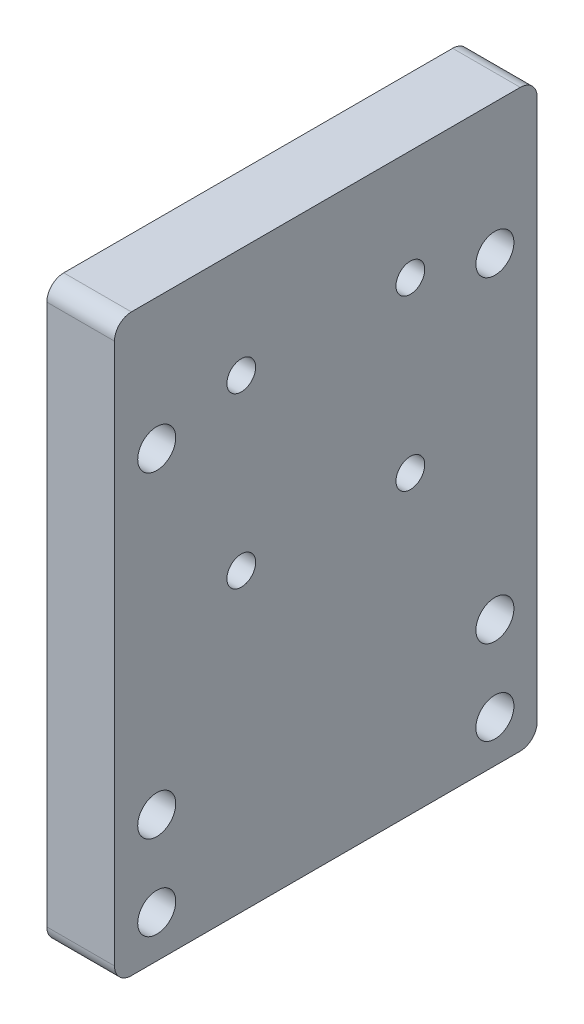
ISO-10303-21;
HEADER;
FILE_DESCRIPTION(('STEP AP214'),'2;1');
FILE_NAME('part.step','',(''),(''),'','','');
FILE_SCHEMA(('AUTOMOTIVE_DESIGN { 1 0 10303 214 1 1 1 1 }'));
ENDSEC;
DATA;
#1=APPLICATION_CONTEXT('core data for automotive mechanical design processes');
#2=APPLICATION_PROTOCOL_DEFINITION('international standard','automotive_design',2000,#1);
#3=PRODUCT_CONTEXT('',#1,'mechanical');
#4=PRODUCT('Part','Part','',(#3));
#5=PRODUCT_RELATED_PRODUCT_CATEGORY('part','',(#4));
#6=PRODUCT_DEFINITION_FORMATION('','',#4);
#7=PRODUCT_DEFINITION_CONTEXT('part definition',#1,'design');
#8=PRODUCT_DEFINITION('design','',#6,#7);
#9=PRODUCT_DEFINITION_SHAPE('','',#8);
#10=(LENGTH_UNIT() NAMED_UNIT(*) SI_UNIT(.MILLI.,.METRE.));
#11=(NAMED_UNIT(*) PLANE_ANGLE_UNIT() SI_UNIT($,.RADIAN.));
#12=(NAMED_UNIT(*) SI_UNIT($,.STERADIAN.) SOLID_ANGLE_UNIT());
#13=UNCERTAINTY_MEASURE_WITH_UNIT(LENGTH_MEASURE(1.E-05),#10,'distance_accuracy_value','');
#14=(GEOMETRIC_REPRESENTATION_CONTEXT(3) GLOBAL_UNCERTAINTY_ASSIGNED_CONTEXT((#13)) GLOBAL_UNIT_ASSIGNED_CONTEXT((#10,
#11,#12)) REPRESENTATION_CONTEXT('',''));
#15=CARTESIAN_POINT('',(0.,0.,0.));
#16=DIRECTION('',(0.,0.,1.));
#17=DIRECTION('',(1.,0.,0.));
#18=AXIS2_PLACEMENT_3D('',#15,#16,#17);
#19=CARTESIAN_POINT('',(8.,-34.,-25.));
#20=DIRECTION('',(0.,0.,1.));
#21=DIRECTION('',(1.,0.,0.));
#22=AXIS2_PLACEMENT_3D('',#19,#20,#21);
#23=PLANE('',#22);
#24=DIRECTION('',(0.,1.,0.));
#25=VECTOR('',#24,1.);
#26=CARTESIAN_POINT('',(8.,-34.,-25.));
#27=LINE('',#26,#25);
#28=CARTESIAN_POINT('',(8.,-32.,-25.));
#29=VERTEX_POINT('',#28);
#30=CARTESIAN_POINT('',(8.,32.,-25.));
#31=VERTEX_POINT('',#30);
#32=EDGE_CURVE('E128',#29,#31,#27,.T.);
#33=ORIENTED_EDGE('',*,*,#32,.F.);
#34=DIRECTION('',(-1.,0.,0.));
#35=VECTOR('',#34,1.);
#36=CARTESIAN_POINT('',(8.,-32.,-25.));
#37=LINE('',#36,#35);
#38=CARTESIAN_POINT('',(0.,-32.,-25.));
#39=VERTEX_POINT('',#38);
#40=EDGE_CURVE('E112',#29,#39,#37,.T.);
#41=ORIENTED_EDGE('',*,*,#40,.T.);
#42=DIRECTION('',(0.,1.,0.));
#43=VECTOR('',#42,1.);
#44=CARTESIAN_POINT('',(0.,-34.,-25.));
#45=LINE('',#44,#43);
#46=CARTESIAN_POINT('',(0.,32.,-25.));
#47=VERTEX_POINT('',#46);
#48=EDGE_CURVE('E125',#39,#47,#45,.T.);
#49=ORIENTED_EDGE('',*,*,#48,.T.);
#50=DIRECTION('',(-1.,0.,0.));
#51=VECTOR('',#50,1.);
#52=CARTESIAN_POINT('',(8.,32.,-25.));
#53=LINE('',#52,#51);
#54=EDGE_CURVE('E131',#47,#31,#53,.F.);
#55=ORIENTED_EDGE('',*,*,#54,.T.);
#56=EDGE_LOOP('',(#33,#41,#49,#55));
#57=FACE_BOUND('',#56,.T.);
#58=ADVANCED_FACE('F40',(#57),#23,.F.);
#59=CARTESIAN_POINT('',(8.,34.,25.));
#60=DIRECTION('',(0.,-1.,0.));
#61=DIRECTION('',(0.,0.,-1.));
#62=AXIS2_PLACEMENT_3D('',#59,#60,#61);
#63=PLANE('',#62);
#64=DIRECTION('',(0.,0.,1.));
#65=VECTOR('',#64,1.);
#66=CARTESIAN_POINT('',(8.,34.,25.));
#67=LINE('',#66,#65);
#68=CARTESIAN_POINT('',(8.,34.,-23.));
#69=VERTEX_POINT('',#68);
#70=CARTESIAN_POINT('',(8.,34.,23.));
#71=VERTEX_POINT('',#70);
#72=EDGE_CURVE('E193',#69,#71,#67,.T.);
#73=ORIENTED_EDGE('',*,*,#72,.F.);
#74=DIRECTION('',(-1.,0.,0.));
#75=VECTOR('',#74,1.);
#76=CARTESIAN_POINT('',(8.,34.,-23.));
#77=LINE('',#76,#75);
#78=CARTESIAN_POINT('',(0.,34.,-23.));
#79=VERTEX_POINT('',#78);
#80=EDGE_CURVE('E11',#69,#79,#77,.T.);
#81=ORIENTED_EDGE('',*,*,#80,.T.);
#82=DIRECTION('',(0.,0.,1.));
#83=VECTOR('',#82,1.);
#84=CARTESIAN_POINT('',(0.,34.,25.));
#85=LINE('',#84,#83);
#86=CARTESIAN_POINT('',(0.,34.,23.));
#87=VERTEX_POINT('',#86);
#88=EDGE_CURVE('E137',#79,#87,#85,.T.);
#89=ORIENTED_EDGE('',*,*,#88,.T.);
#90=DIRECTION('',(-1.,0.,0.));
#91=VECTOR('',#90,1.);
#92=CARTESIAN_POINT('',(8.,34.,23.));
#93=LINE('',#92,#91);
#94=EDGE_CURVE('E49',#87,#71,#93,.F.);
#95=ORIENTED_EDGE('',*,*,#94,.T.);
#96=EDGE_LOOP('',(#73,#81,#89,#95));
#97=FACE_BOUND('',#96,.T.);
#98=ADVANCED_FACE('F192',(#97),#63,.F.);
#99=CARTESIAN_POINT('',(8.,-34.,25.));
#100=DIRECTION('',(0.,0.,-1.));
#101=DIRECTION('',(-1.,0.,0.));
#102=AXIS2_PLACEMENT_3D('',#99,#100,#101);
#103=PLANE('',#102);
#104=DIRECTION('',(0.,-1.,0.));
#105=VECTOR('',#104,1.);
#106=CARTESIAN_POINT('',(0.,-34.,25.));
#107=LINE('',#106,#105);
#108=CARTESIAN_POINT('',(0.,32.,25.));
#109=VERTEX_POINT('',#108);
#110=CARTESIAN_POINT('',(0.,-32.,25.));
#111=VERTEX_POINT('',#110);
#112=EDGE_CURVE('E144',#109,#111,#107,.T.);
#113=ORIENTED_EDGE('',*,*,#112,.T.);
#114=DIRECTION('',(-1.,0.,0.));
#115=VECTOR('',#114,1.);
#116=CARTESIAN_POINT('',(8.,-32.,25.));
#117=LINE('',#116,#115);
#118=CARTESIAN_POINT('',(8.,-32.,25.));
#119=VERTEX_POINT('',#118);
#120=EDGE_CURVE('E56',#111,#119,#117,.F.);
#121=ORIENTED_EDGE('',*,*,#120,.T.);
#122=DIRECTION('',(0.,-1.,0.));
#123=VECTOR('',#122,1.);
#124=CARTESIAN_POINT('',(8.,-34.,25.));
#125=LINE('',#124,#123);
#126=CARTESIAN_POINT('',(8.,32.,25.));
#127=VERTEX_POINT('',#126);
#128=EDGE_CURVE('E200',#127,#119,#125,.T.);
#129=ORIENTED_EDGE('',*,*,#128,.F.);
#130=DIRECTION('',(-1.,0.,0.));
#131=VECTOR('',#130,1.);
#132=CARTESIAN_POINT('',(8.,32.,25.));
#133=LINE('',#132,#131);
#134=EDGE_CURVE('E182',#127,#109,#133,.T.);
#135=ORIENTED_EDGE('',*,*,#134,.T.);
#136=EDGE_LOOP('',(#113,#121,#129,#135));
#137=FACE_BOUND('',#136,.T.);
#138=ADVANCED_FACE('F204',(#137),#103,.F.);
#139=CARTESIAN_POINT('',(8.,-34.,25.));
#140=DIRECTION('',(0.,1.,0.));
#141=DIRECTION('',(0.,0.,1.));
#142=AXIS2_PLACEMENT_3D('',#139,#140,#141);
#143=PLANE('',#142);
#144=DIRECTION('',(0.,0.,-1.));
#145=VECTOR('',#144,1.);
#146=CARTESIAN_POINT('',(0.,-34.,25.));
#147=LINE('',#146,#145);
#148=CARTESIAN_POINT('',(0.,-34.,23.));
#149=VERTEX_POINT('',#148);
#150=CARTESIAN_POINT('',(0.,-34.,-23.));
#151=VERTEX_POINT('',#150);
#152=EDGE_CURVE('E155',#149,#151,#147,.T.);
#153=ORIENTED_EDGE('',*,*,#152,.T.);
#154=DIRECTION('',(-1.,0.,0.));
#155=VECTOR('',#154,1.);
#156=CARTESIAN_POINT('',(8.,-34.,-23.));
#157=LINE('',#156,#155);
#158=CARTESIAN_POINT('',(8.,-34.,-23.));
#159=VERTEX_POINT('',#158);
#160=EDGE_CURVE('E113',#151,#159,#157,.F.);
#161=ORIENTED_EDGE('',*,*,#160,.T.);
#162=DIRECTION('',(0.,0.,-1.));
#163=VECTOR('',#162,1.);
#164=CARTESIAN_POINT('',(8.,-34.,25.));
#165=LINE('',#164,#163);
#166=CARTESIAN_POINT('',(8.,-34.,23.));
#167=VERTEX_POINT('',#166);
#168=EDGE_CURVE('E150',#167,#159,#165,.T.);
#169=ORIENTED_EDGE('',*,*,#168,.F.);
#170=DIRECTION('',(-1.,0.,0.));
#171=VECTOR('',#170,1.);
#172=CARTESIAN_POINT('',(8.,-34.,23.));
#173=LINE('',#172,#171);
#174=EDGE_CURVE('E119',#167,#149,#173,.T.);
#175=ORIENTED_EDGE('',*,*,#174,.T.);
#176=EDGE_LOOP('',(#153,#161,#169,#175));
#177=FACE_BOUND('',#176,.T.);
#178=ADVANCED_FACE('F211',(#177),#143,.F.);
#179=CARTESIAN_POINT('',(8.,0.,0.));
#180=DIRECTION('',(-1.,0.,0.));
#181=DIRECTION('',(0.,0.,1.));
#182=AXIS2_PLACEMENT_3D('',#179,#180,#181);
#183=PLANE('',#182);
#184=CARTESIAN_POINT('',(8.00000000000001,-19.,20.));
#185=DIRECTION('',(-1.,0.,0.));
#186=DIRECTION('',(0.,0.,1.));
#187=AXIS2_PLACEMENT_3D('',#184,#185,#186);
#188=CIRCLE('',#187,2.24999999999999);
#189=CARTESIAN_POINT('',(8.00000000000001,-19.,22.25));
#190=VERTEX_POINT('',#189);
#191=EDGE_CURVE('E306',#190,#190,#188,.T.);
#192=ORIENTED_EDGE('',*,*,#191,.T.);
#193=EDGE_LOOP('',(#192));
#194=FACE_BOUND('',#193,.T.);
#195=CARTESIAN_POINT('',(8.00000000000001,18.5,20.));
#196=DIRECTION('',(-1.,0.,0.));
#197=DIRECTION('',(0.,0.,1.));
#198=AXIS2_PLACEMENT_3D('',#195,#196,#197);
#199=CIRCLE('',#198,2.24999999999999);
#200=CARTESIAN_POINT('',(8.00000000000001,18.5,22.25));
#201=VERTEX_POINT('',#200);
#202=EDGE_CURVE('E294',#201,#201,#199,.T.);
#203=ORIENTED_EDGE('',*,*,#202,.T.);
#204=EDGE_LOOP('',(#203));
#205=FACE_BOUND('',#204,.T.);
#206=CARTESIAN_POINT('',(8.00000000000001,18.5,-20.));
#207=DIRECTION('',(-1.,0.,0.));
#208=DIRECTION('',(0.,0.,1.));
#209=AXIS2_PLACEMENT_3D('',#206,#207,#208);
#210=CIRCLE('',#209,2.24999999999999);
#211=CARTESIAN_POINT('',(8.00000000000001,18.5,-17.75));
#212=VERTEX_POINT('',#211);
#213=EDGE_CURVE('E282',#212,#212,#210,.T.);
#214=ORIENTED_EDGE('',*,*,#213,.T.);
#215=EDGE_LOOP('',(#214));
#216=FACE_BOUND('',#215,.T.);
#217=CARTESIAN_POINT('',(8.00000000000001,-19.,-20.));
#218=DIRECTION('',(-1.,0.,0.));
#219=DIRECTION('',(0.,0.,1.));
#220=AXIS2_PLACEMENT_3D('',#217,#218,#219);
#221=CIRCLE('',#220,2.24999999999999);
#222=CARTESIAN_POINT('',(8.00000000000001,-19.,-17.75));
#223=VERTEX_POINT('',#222);
#224=EDGE_CURVE('E270',#223,#223,#221,.T.);
#225=ORIENTED_EDGE('',*,*,#224,.T.);
#226=EDGE_LOOP('',(#225));
#227=FACE_BOUND('',#226,.T.);
#228=CARTESIAN_POINT('',(8.,-29.,-20.));
#229=DIRECTION('',(-1.,0.,0.));
#230=DIRECTION('',(0.,0.,1.));
#231=AXIS2_PLACEMENT_3D('',#228,#229,#230);
#232=CIRCLE('',#231,2.25);
#233=CARTESIAN_POINT('',(8.,-29.,-17.75));
#234=VERTEX_POINT('',#233);
#235=EDGE_CURVE('E258',#234,#234,#232,.T.);
#236=ORIENTED_EDGE('',*,*,#235,.T.);
#237=EDGE_LOOP('',(#236));
#238=FACE_BOUND('',#237,.T.);
#239=CARTESIAN_POINT('',(8.,-29.,20.));
#240=DIRECTION('',(-1.,0.,0.));
#241=DIRECTION('',(0.,0.,1.));
#242=AXIS2_PLACEMENT_3D('',#239,#240,#241);
#243=CIRCLE('',#242,2.25);
#244=CARTESIAN_POINT('',(8.,-29.,22.25));
#245=VERTEX_POINT('',#244);
#246=EDGE_CURVE('E246',#245,#245,#243,.T.);
#247=ORIENTED_EDGE('',*,*,#246,.T.);
#248=EDGE_LOOP('',(#247));
#249=FACE_BOUND('',#248,.T.);
#250=CARTESIAN_POINT('',(8.,21.,10.));
#251=DIRECTION('',(1.,0.,0.));
#252=DIRECTION('',(0.,0.,-1.));
#253=AXIS2_PLACEMENT_3D('',#250,#251,#252);
#254=CIRCLE('',#253,1.7);
#255=CARTESIAN_POINT('',(8.,21.,8.30000000000001));
#256=VERTEX_POINT('',#255);
#257=EDGE_CURVE('E242',#256,#256,#254,.T.);
#258=ORIENTED_EDGE('',*,*,#257,.F.);
#259=EDGE_LOOP('',(#258));
#260=FACE_BOUND('',#259,.T.);
#261=CARTESIAN_POINT('',(8.,21.,-10.));
#262=DIRECTION('',(1.,0.,0.));
#263=DIRECTION('',(0.,0.,-1.));
#264=AXIS2_PLACEMENT_3D('',#261,#262,#263);
#265=CIRCLE('',#264,1.7);
#266=CARTESIAN_POINT('',(8.,21.,-11.7));
#267=VERTEX_POINT('',#266);
#268=EDGE_CURVE('E234',#267,#267,#265,.T.);
#269=ORIENTED_EDGE('',*,*,#268,.F.);
#270=EDGE_LOOP('',(#269));
#271=FACE_BOUND('',#270,.T.);
#272=CARTESIAN_POINT('',(8.,0.999999999999982,-10.));
#273=DIRECTION('',(1.,0.,0.));
#274=DIRECTION('',(0.,0.,-1.));
#275=AXIS2_PLACEMENT_3D('',#272,#273,#274);
#276=CIRCLE('',#275,1.7);
#277=CARTESIAN_POINT('',(8.,0.999999999999982,-11.7));
#278=VERTEX_POINT('',#277);
#279=EDGE_CURVE('E226',#278,#278,#276,.T.);
#280=ORIENTED_EDGE('',*,*,#279,.F.);
#281=EDGE_LOOP('',(#280));
#282=FACE_BOUND('',#281,.T.);
#283=CARTESIAN_POINT('',(8.,0.99999999999998,10.));
#284=DIRECTION('',(1.,0.,0.));
#285=DIRECTION('',(0.,0.,-1.));
#286=AXIS2_PLACEMENT_3D('',#283,#284,#285);
#287=CIRCLE('',#286,1.7);
#288=CARTESIAN_POINT('',(8.,0.99999999999998,8.30000000000001));
#289=VERTEX_POINT('',#288);
#290=EDGE_CURVE('E147',#289,#289,#287,.T.);
#291=ORIENTED_EDGE('',*,*,#290,.F.);
#292=EDGE_LOOP('',(#291));
#293=FACE_BOUND('',#292,.T.);
#294=ORIENTED_EDGE('',*,*,#168,.T.);
#295=CARTESIAN_POINT('',(8.,-32.,-23.));
#296=DIRECTION('',(-1.,0.,0.));
#297=DIRECTION('',(0.,0.,1.));
#298=AXIS2_PLACEMENT_3D('',#295,#296,#297);
#299=CIRCLE('',#298,2.);
#300=EDGE_CURVE('E179',#159,#29,#299,.F.);
#301=ORIENTED_EDGE('',*,*,#300,.T.);
#302=ORIENTED_EDGE('',*,*,#32,.T.);
#303=CARTESIAN_POINT('',(8.,32.,-23.));
#304=DIRECTION('',(-1.,0.,0.));
#305=DIRECTION('',(0.,0.,1.));
#306=AXIS2_PLACEMENT_3D('',#303,#304,#305);
#307=CIRCLE('',#306,2.);
#308=EDGE_CURVE('E173',#31,#69,#307,.F.);
#309=ORIENTED_EDGE('',*,*,#308,.T.);
#310=ORIENTED_EDGE('',*,*,#72,.T.);
#311=CARTESIAN_POINT('',(8.,32.,23.));
#312=DIRECTION('',(-1.,0.,0.));
#313=DIRECTION('',(0.,0.,1.));
#314=AXIS2_PLACEMENT_3D('',#311,#312,#313);
#315=CIRCLE('',#314,2.);
#316=EDGE_CURVE('E63',#71,#127,#315,.F.);
#317=ORIENTED_EDGE('',*,*,#316,.T.);
#318=ORIENTED_EDGE('',*,*,#128,.T.);
#319=CARTESIAN_POINT('',(8.,-32.,23.));
#320=DIRECTION('',(-1.,0.,0.));
#321=DIRECTION('',(0.,0.,1.));
#322=AXIS2_PLACEMENT_3D('',#319,#320,#321);
#323=CIRCLE('',#322,2.);
#324=EDGE_CURVE('E176',#119,#167,#323,.F.);
#325=ORIENTED_EDGE('',*,*,#324,.T.);
#326=EDGE_LOOP('',(#294,#301,#302,#309,#310,#317,#318,#325));
#327=FACE_BOUND('',#326,.T.);
#328=ADVANCED_FACE('F197',(#194,#205,#216,#227,#238,#249,#260,#271,#282,#293,#327),#183,.F.);
#329=CARTESIAN_POINT('',(0.,0.,0.));
#330=DIRECTION('',(-1.,0.,0.));
#331=DIRECTION('',(0.,0.,1.));
#332=AXIS2_PLACEMENT_3D('',#329,#330,#331);
#333=PLANE('',#332);
#334=CARTESIAN_POINT('',(0.,-19.,20.));
#335=DIRECTION('',(-1.,0.,0.));
#336=DIRECTION('',(0.,0.,1.));
#337=AXIS2_PLACEMENT_3D('',#334,#335,#336);
#338=CIRCLE('',#337,4.48);
#339=CARTESIAN_POINT('',(0.,-19.,24.48));
#340=VERTEX_POINT('',#339);
#341=EDGE_CURVE('E314',#340,#340,#338,.T.);
#342=ORIENTED_EDGE('',*,*,#341,.F.);
#343=EDGE_LOOP('',(#342));
#344=FACE_BOUND('',#343,.T.);
#345=CARTESIAN_POINT('',(0.,18.5,20.));
#346=DIRECTION('',(-1.,0.,0.));
#347=DIRECTION('',(0.,0.,1.));
#348=AXIS2_PLACEMENT_3D('',#345,#346,#347);
#349=CIRCLE('',#348,4.48);
#350=CARTESIAN_POINT('',(0.,18.5,24.48));
#351=VERTEX_POINT('',#350);
#352=EDGE_CURVE('E302',#351,#351,#349,.T.);
#353=ORIENTED_EDGE('',*,*,#352,.F.);
#354=EDGE_LOOP('',(#353));
#355=FACE_BOUND('',#354,.T.);
#356=CARTESIAN_POINT('',(0.,18.5,-20.));
#357=DIRECTION('',(-1.,0.,0.));
#358=DIRECTION('',(0.,0.,1.));
#359=AXIS2_PLACEMENT_3D('',#356,#357,#358);
#360=CIRCLE('',#359,4.48);
#361=CARTESIAN_POINT('',(0.,18.5,-15.52));
#362=VERTEX_POINT('',#361);
#363=EDGE_CURVE('E290',#362,#362,#360,.T.);
#364=ORIENTED_EDGE('',*,*,#363,.F.);
#365=EDGE_LOOP('',(#364));
#366=FACE_BOUND('',#365,.T.);
#367=CARTESIAN_POINT('',(0.,-19.,-20.));
#368=DIRECTION('',(-1.,0.,0.));
#369=DIRECTION('',(0.,0.,1.));
#370=AXIS2_PLACEMENT_3D('',#367,#368,#369);
#371=CIRCLE('',#370,4.48);
#372=CARTESIAN_POINT('',(0.,-19.,-15.52));
#373=VERTEX_POINT('',#372);
#374=EDGE_CURVE('E278',#373,#373,#371,.T.);
#375=ORIENTED_EDGE('',*,*,#374,.F.);
#376=EDGE_LOOP('',(#375));
#377=FACE_BOUND('',#376,.T.);
#378=CARTESIAN_POINT('',(0.,-29.,-20.));
#379=DIRECTION('',(-1.,0.,0.));
#380=DIRECTION('',(0.,0.,1.));
#381=AXIS2_PLACEMENT_3D('',#378,#379,#380);
#382=CIRCLE('',#381,4.48);
#383=CARTESIAN_POINT('',(0.,-29.,-15.52));
#384=VERTEX_POINT('',#383);
#385=EDGE_CURVE('E266',#384,#384,#382,.T.);
#386=ORIENTED_EDGE('',*,*,#385,.F.);
#387=EDGE_LOOP('',(#386));
#388=FACE_BOUND('',#387,.T.);
#389=CARTESIAN_POINT('',(0.,-29.,20.));
#390=DIRECTION('',(-1.,0.,0.));
#391=DIRECTION('',(0.,0.,1.));
#392=AXIS2_PLACEMENT_3D('',#389,#390,#391);
#393=CIRCLE('',#392,4.48);
#394=CARTESIAN_POINT('',(0.,-29.,24.48));
#395=VERTEX_POINT('',#394);
#396=EDGE_CURVE('E254',#395,#395,#393,.T.);
#397=ORIENTED_EDGE('',*,*,#396,.F.);
#398=EDGE_LOOP('',(#397));
#399=FACE_BOUND('',#398,.T.);
#400=CARTESIAN_POINT('',(0.,21.,10.));
#401=DIRECTION('',(1.,0.,0.));
#402=DIRECTION('',(0.,0.,-1.));
#403=AXIS2_PLACEMENT_3D('',#400,#401,#402);
#404=CIRCLE('',#403,1.69999999999999);
#405=CARTESIAN_POINT('',(0.,21.,8.30000000000001));
#406=VERTEX_POINT('',#405);
#407=EDGE_CURVE('E238',#406,#406,#404,.T.);
#408=ORIENTED_EDGE('',*,*,#407,.T.);
#409=EDGE_LOOP('',(#408));
#410=FACE_BOUND('',#409,.T.);
#411=CARTESIAN_POINT('',(0.,21.,-10.));
#412=DIRECTION('',(1.,0.,0.));
#413=DIRECTION('',(0.,0.,-1.));
#414=AXIS2_PLACEMENT_3D('',#411,#412,#413);
#415=CIRCLE('',#414,1.69999999999999);
#416=CARTESIAN_POINT('',(0.,21.,-11.7));
#417=VERTEX_POINT('',#416);
#418=EDGE_CURVE('E230',#417,#417,#415,.T.);
#419=ORIENTED_EDGE('',*,*,#418,.T.);
#420=EDGE_LOOP('',(#419));
#421=FACE_BOUND('',#420,.T.);
#422=CARTESIAN_POINT('',(0.,0.999999999999982,-10.));
#423=DIRECTION('',(1.,0.,0.));
#424=DIRECTION('',(0.,0.,-1.));
#425=AXIS2_PLACEMENT_3D('',#422,#423,#424);
#426=CIRCLE('',#425,1.69999999999999);
#427=CARTESIAN_POINT('',(0.,0.999999999999982,-11.7));
#428=VERTEX_POINT('',#427);
#429=EDGE_CURVE('E222',#428,#428,#426,.T.);
#430=ORIENTED_EDGE('',*,*,#429,.T.);
#431=EDGE_LOOP('',(#430));
#432=FACE_BOUND('',#431,.T.);
#433=CARTESIAN_POINT('',(0.,0.99999999999998,10.));
#434=DIRECTION('',(1.,0.,0.));
#435=DIRECTION('',(0.,0.,-1.));
#436=AXIS2_PLACEMENT_3D('',#433,#434,#435);
#437=CIRCLE('',#436,1.69999999999999);
#438=CARTESIAN_POINT('',(0.,0.99999999999998,8.30000000000001));
#439=VERTEX_POINT('',#438);
#440=EDGE_CURVE('E138',#439,#439,#437,.T.);
#441=ORIENTED_EDGE('',*,*,#440,.T.);
#442=EDGE_LOOP('',(#441));
#443=FACE_BOUND('',#442,.T.);
#444=ORIENTED_EDGE('',*,*,#48,.F.);
#445=CARTESIAN_POINT('',(0.,-32.,-23.));
#446=DIRECTION('',(-1.,0.,0.));
#447=DIRECTION('',(0.,0.,1.));
#448=AXIS2_PLACEMENT_3D('',#445,#446,#447);
#449=CIRCLE('',#448,2.);
#450=EDGE_CURVE('E108',#39,#151,#449,.T.);
#451=ORIENTED_EDGE('',*,*,#450,.T.);
#452=ORIENTED_EDGE('',*,*,#152,.F.);
#453=CARTESIAN_POINT('',(0.,-32.,23.));
#454=DIRECTION('',(-1.,0.,0.));
#455=DIRECTION('',(0.,0.,1.));
#456=AXIS2_PLACEMENT_3D('',#453,#454,#455);
#457=CIRCLE('',#456,2.);
#458=EDGE_CURVE('E120',#149,#111,#457,.T.);
#459=ORIENTED_EDGE('',*,*,#458,.T.);
#460=ORIENTED_EDGE('',*,*,#112,.F.);
#461=CARTESIAN_POINT('',(0.,32.,23.));
#462=DIRECTION('',(-1.,0.,0.));
#463=DIRECTION('',(0.,0.,1.));
#464=AXIS2_PLACEMENT_3D('',#461,#462,#463);
#465=CIRCLE('',#464,2.);
#466=EDGE_CURVE('E130',#109,#87,#465,.T.);
#467=ORIENTED_EDGE('',*,*,#466,.T.);
#468=ORIENTED_EDGE('',*,*,#88,.F.);
#469=CARTESIAN_POINT('',(0.,32.,-23.));
#470=DIRECTION('',(-1.,0.,0.));
#471=DIRECTION('',(0.,0.,1.));
#472=AXIS2_PLACEMENT_3D('',#469,#470,#471);
#473=CIRCLE('',#472,2.);
#474=EDGE_CURVE('E135',#79,#47,#473,.T.);
#475=ORIENTED_EDGE('',*,*,#474,.T.);
#476=EDGE_LOOP('',(#444,#451,#452,#459,#460,#467,#468,#475));
#477=FACE_BOUND('',#476,.T.);
#478=ADVANCED_FACE('F133',(#344,#355,#366,#377,#388,#399,#410,#421,#432,#443,#477),#333,.T.);
#479=CARTESIAN_POINT('',(8.,0.99999999999998,10.));
#480=DIRECTION('',(1.,0.,0.));
#481=DIRECTION('',(0.,0.,-1.));
#482=AXIS2_PLACEMENT_3D('',#479,#480,#481);
#483=CYLINDRICAL_SURFACE('',#482,1.69999999999999);
#484=ORIENTED_EDGE('',*,*,#440,.F.);
#485=EDGE_LOOP('',(#484));
#486=FACE_BOUND('',#485,.T.);
#487=ORIENTED_EDGE('',*,*,#290,.T.);
#488=EDGE_LOOP('',(#487));
#489=FACE_BOUND('',#488,.T.);
#490=ADVANCED_FACE('F324',(#486,#489),#483,.F.);
#491=CARTESIAN_POINT('',(8.,0.999999999999982,-10.));
#492=DIRECTION('',(1.,0.,0.));
#493=DIRECTION('',(0.,0.,-1.));
#494=AXIS2_PLACEMENT_3D('',#491,#492,#493);
#495=CYLINDRICAL_SURFACE('',#494,1.69999999999999);
#496=ORIENTED_EDGE('',*,*,#429,.F.);
#497=EDGE_LOOP('',(#496));
#498=FACE_BOUND('',#497,.T.);
#499=ORIENTED_EDGE('',*,*,#279,.T.);
#500=EDGE_LOOP('',(#499));
#501=FACE_BOUND('',#500,.T.);
#502=ADVANCED_FACE('F346',(#498,#501),#495,.F.);
#503=CARTESIAN_POINT('',(8.,21.,-10.));
#504=DIRECTION('',(1.,0.,0.));
#505=DIRECTION('',(0.,0.,-1.));
#506=AXIS2_PLACEMENT_3D('',#503,#504,#505);
#507=CYLINDRICAL_SURFACE('',#506,1.69999999999999);
#508=ORIENTED_EDGE('',*,*,#418,.F.);
#509=EDGE_LOOP('',(#508));
#510=FACE_BOUND('',#509,.T.);
#511=ORIENTED_EDGE('',*,*,#268,.T.);
#512=EDGE_LOOP('',(#511));
#513=FACE_BOUND('',#512,.T.);
#514=ADVANCED_FACE('F411',(#510,#513),#507,.F.);
#515=CARTESIAN_POINT('',(8.,21.,10.));
#516=DIRECTION('',(1.,0.,0.));
#517=DIRECTION('',(0.,0.,-1.));
#518=AXIS2_PLACEMENT_3D('',#515,#516,#517);
#519=CYLINDRICAL_SURFACE('',#518,1.69999999999999);
#520=ORIENTED_EDGE('',*,*,#407,.F.);
#521=EDGE_LOOP('',(#520));
#522=FACE_BOUND('',#521,.T.);
#523=ORIENTED_EDGE('',*,*,#257,.T.);
#524=EDGE_LOOP('',(#523));
#525=FACE_BOUND('',#524,.T.);
#526=ADVANCED_FACE('F407',(#522,#525),#519,.F.);
#527=CARTESIAN_POINT('',(0.,-29.,20.));
#528=DIRECTION('',(-1.,0.,0.));
#529=DIRECTION('',(0.,0.,1.));
#530=AXIS2_PLACEMENT_3D('',#527,#528,#529);
#531=CYLINDRICAL_SURFACE('',#530,2.25);
#532=ORIENTED_EDGE('',*,*,#246,.F.);
#533=EDGE_LOOP('',(#532));
#534=FACE_BOUND('',#533,.T.);
#535=CARTESIAN_POINT('',(2.23,-29.,20.));
#536=DIRECTION('',(-1.,0.,0.));
#537=DIRECTION('',(0.,0.,1.));
#538=AXIS2_PLACEMENT_3D('',#535,#536,#537);
#539=CIRCLE('',#538,2.25);
#540=CARTESIAN_POINT('',(2.23,-29.,22.25));
#541=VERTEX_POINT('',#540);
#542=EDGE_CURVE('E250',#541,#541,#539,.T.);
#543=ORIENTED_EDGE('',*,*,#542,.T.);
#544=EDGE_LOOP('',(#543));
#545=FACE_BOUND('',#544,.T.);
#546=ADVANCED_FACE('F403',(#534,#545),#531,.F.);
#547=CARTESIAN_POINT('',(0.,-29.,20.));
#548=DIRECTION('',(-1.,0.,0.));
#549=DIRECTION('',(0.,0.,1.));
#550=AXIS2_PLACEMENT_3D('',#547,#548,#549);
#551=CONICAL_SURFACE('',#550,4.48,0.785398163397448);
#552=ORIENTED_EDGE('',*,*,#542,.F.);
#553=EDGE_LOOP('',(#552));
#554=FACE_BOUND('',#553,.T.);
#555=ORIENTED_EDGE('',*,*,#396,.T.);
#556=EDGE_LOOP('',(#555));
#557=FACE_BOUND('',#556,.T.);
#558=ADVANCED_FACE('F399',(#554,#557),#551,.F.);
#559=CARTESIAN_POINT('',(0.,-29.,-20.));
#560=DIRECTION('',(-1.,0.,0.));
#561=DIRECTION('',(0.,0.,1.));
#562=AXIS2_PLACEMENT_3D('',#559,#560,#561);
#563=CYLINDRICAL_SURFACE('',#562,2.25);
#564=ORIENTED_EDGE('',*,*,#235,.F.);
#565=EDGE_LOOP('',(#564));
#566=FACE_BOUND('',#565,.T.);
#567=CARTESIAN_POINT('',(2.23,-29.,-20.));
#568=DIRECTION('',(-1.,0.,0.));
#569=DIRECTION('',(0.,0.,1.));
#570=AXIS2_PLACEMENT_3D('',#567,#568,#569);
#571=CIRCLE('',#570,2.25);
#572=CARTESIAN_POINT('',(2.23,-29.,-17.75));
#573=VERTEX_POINT('',#572);
#574=EDGE_CURVE('E262',#573,#573,#571,.T.);
#575=ORIENTED_EDGE('',*,*,#574,.T.);
#576=EDGE_LOOP('',(#575));
#577=FACE_BOUND('',#576,.T.);
#578=ADVANCED_FACE('F395',(#566,#577),#563,.F.);
#579=CARTESIAN_POINT('',(0.,-29.,-20.));
#580=DIRECTION('',(-1.,0.,0.));
#581=DIRECTION('',(0.,0.,1.));
#582=AXIS2_PLACEMENT_3D('',#579,#580,#581);
#583=CONICAL_SURFACE('',#582,4.48,0.785398163397448);
#584=ORIENTED_EDGE('',*,*,#574,.F.);
#585=EDGE_LOOP('',(#584));
#586=FACE_BOUND('',#585,.T.);
#587=ORIENTED_EDGE('',*,*,#385,.T.);
#588=EDGE_LOOP('',(#587));
#589=FACE_BOUND('',#588,.T.);
#590=ADVANCED_FACE('F368',(#586,#589),#583,.F.);
#591=CARTESIAN_POINT('',(8.,-32.,-23.));
#592=DIRECTION('',(-1.,0.,0.));
#593=DIRECTION('',(0.,0.,1.));
#594=AXIS2_PLACEMENT_3D('',#591,#592,#593);
#595=CYLINDRICAL_SURFACE('',#594,2.);
#596=ORIENTED_EDGE('',*,*,#300,.F.);
#597=ORIENTED_EDGE('',*,*,#160,.F.);
#598=ORIENTED_EDGE('',*,*,#450,.F.);
#599=ORIENTED_EDGE('',*,*,#40,.F.);
#600=EDGE_LOOP('',(#596,#597,#598,#599));
#601=FACE_BOUND('',#600,.T.);
#602=ADVANCED_FACE('F111',(#601),#595,.T.);
#603=CARTESIAN_POINT('',(8.,-32.,23.));
#604=DIRECTION('',(-1.,0.,0.));
#605=DIRECTION('',(0.,0.,1.));
#606=AXIS2_PLACEMENT_3D('',#603,#604,#605);
#607=CYLINDRICAL_SURFACE('',#606,2.);
#608=ORIENTED_EDGE('',*,*,#324,.F.);
#609=ORIENTED_EDGE('',*,*,#120,.F.);
#610=ORIENTED_EDGE('',*,*,#458,.F.);
#611=ORIENTED_EDGE('',*,*,#174,.F.);
#612=EDGE_LOOP('',(#608,#609,#610,#611));
#613=FACE_BOUND('',#612,.T.);
#614=ADVANCED_FACE('F208',(#613),#607,.T.);
#615=CARTESIAN_POINT('',(8.,32.,-23.));
#616=DIRECTION('',(-1.,0.,0.));
#617=DIRECTION('',(0.,0.,1.));
#618=AXIS2_PLACEMENT_3D('',#615,#616,#617);
#619=CYLINDRICAL_SURFACE('',#618,2.);
#620=ORIENTED_EDGE('',*,*,#308,.F.);
#621=ORIENTED_EDGE('',*,*,#54,.F.);
#622=ORIENTED_EDGE('',*,*,#474,.F.);
#623=ORIENTED_EDGE('',*,*,#80,.F.);
#624=EDGE_LOOP('',(#620,#621,#622,#623));
#625=FACE_BOUND('',#624,.T.);
#626=ADVANCED_FACE('F370',(#625),#619,.T.);
#627=CARTESIAN_POINT('',(8.,32.,23.));
#628=DIRECTION('',(-1.,0.,0.));
#629=DIRECTION('',(0.,0.,1.));
#630=AXIS2_PLACEMENT_3D('',#627,#628,#629);
#631=CYLINDRICAL_SURFACE('',#630,2.);
#632=ORIENTED_EDGE('',*,*,#316,.F.);
#633=ORIENTED_EDGE('',*,*,#94,.F.);
#634=ORIENTED_EDGE('',*,*,#466,.F.);
#635=ORIENTED_EDGE('',*,*,#134,.F.);
#636=EDGE_LOOP('',(#632,#633,#634,#635));
#637=FACE_BOUND('',#636,.T.);
#638=ADVANCED_FACE('F42',(#637),#631,.T.);
#639=CARTESIAN_POINT('',(0.,-19.,-20.));
#640=DIRECTION('',(-1.,0.,0.));
#641=DIRECTION('',(0.,0.,1.));
#642=AXIS2_PLACEMENT_3D('',#639,#640,#641);
#643=CYLINDRICAL_SURFACE('',#642,2.24999999999999);
#644=ORIENTED_EDGE('',*,*,#224,.F.);
#645=EDGE_LOOP('',(#644));
#646=FACE_BOUND('',#645,.T.);
#647=CARTESIAN_POINT('',(2.23,-19.,-20.));
#648=DIRECTION('',(-1.,0.,0.));
#649=DIRECTION('',(0.,0.,1.));
#650=AXIS2_PLACEMENT_3D('',#647,#648,#649);
#651=CIRCLE('',#650,2.25);
#652=CARTESIAN_POINT('',(2.23,-19.,-17.75));
#653=VERTEX_POINT('',#652);
#654=EDGE_CURVE('E274',#653,#653,#651,.T.);
#655=ORIENTED_EDGE('',*,*,#654,.T.);
#656=EDGE_LOOP('',(#655));
#657=FACE_BOUND('',#656,.T.);
#658=ADVANCED_FACE('F376',(#646,#657),#643,.F.);
#659=CARTESIAN_POINT('',(0.,-19.,-20.));
#660=DIRECTION('',(-1.,0.,0.));
#661=DIRECTION('',(0.,0.,1.));
#662=AXIS2_PLACEMENT_3D('',#659,#660,#661);
#663=CONICAL_SURFACE('',#662,4.48,0.785398163397449);
#664=ORIENTED_EDGE('',*,*,#654,.F.);
#665=EDGE_LOOP('',(#664));
#666=FACE_BOUND('',#665,.T.);
#667=ORIENTED_EDGE('',*,*,#374,.T.);
#668=EDGE_LOOP('',(#667));
#669=FACE_BOUND('',#668,.T.);
#670=ADVANCED_FACE('F380',(#666,#669),#663,.F.);
#671=CARTESIAN_POINT('',(0.,18.5,-20.));
#672=DIRECTION('',(-1.,0.,0.));
#673=DIRECTION('',(0.,0.,1.));
#674=AXIS2_PLACEMENT_3D('',#671,#672,#673);
#675=CYLINDRICAL_SURFACE('',#674,2.24999999999999);
#676=ORIENTED_EDGE('',*,*,#213,.F.);
#677=EDGE_LOOP('',(#676));
#678=FACE_BOUND('',#677,.T.);
#679=CARTESIAN_POINT('',(2.23,18.5,-20.));
#680=DIRECTION('',(-1.,0.,0.));
#681=DIRECTION('',(0.,0.,1.));
#682=AXIS2_PLACEMENT_3D('',#679,#680,#681);
#683=CIRCLE('',#682,2.25);
#684=CARTESIAN_POINT('',(2.23,18.5,-17.75));
#685=VERTEX_POINT('',#684);
#686=EDGE_CURVE('E286',#685,#685,#683,.T.);
#687=ORIENTED_EDGE('',*,*,#686,.T.);
#688=EDGE_LOOP('',(#687));
#689=FACE_BOUND('',#688,.T.);
#690=ADVANCED_FACE('F386',(#678,#689),#675,.F.);
#691=CARTESIAN_POINT('',(0.,18.5,-20.));
#692=DIRECTION('',(-1.,0.,0.));
#693=DIRECTION('',(0.,0.,1.));
#694=AXIS2_PLACEMENT_3D('',#691,#692,#693);
#695=CONICAL_SURFACE('',#694,4.48,0.785398163397449);
#696=ORIENTED_EDGE('',*,*,#686,.F.);
#697=EDGE_LOOP('',(#696));
#698=FACE_BOUND('',#697,.T.);
#699=ORIENTED_EDGE('',*,*,#363,.T.);
#700=EDGE_LOOP('',(#699));
#701=FACE_BOUND('',#700,.T.);
#702=ADVANCED_FACE('F486',(#698,#701),#695,.F.);
#703=CARTESIAN_POINT('',(0.,18.5,20.));
#704=DIRECTION('',(-1.,0.,0.));
#705=DIRECTION('',(0.,0.,1.));
#706=AXIS2_PLACEMENT_3D('',#703,#704,#705);
#707=CYLINDRICAL_SURFACE('',#706,2.24999999999999);
#708=ORIENTED_EDGE('',*,*,#202,.F.);
#709=EDGE_LOOP('',(#708));
#710=FACE_BOUND('',#709,.T.);
#711=CARTESIAN_POINT('',(2.23,18.5,20.));
#712=DIRECTION('',(-1.,0.,0.));
#713=DIRECTION('',(0.,0.,1.));
#714=AXIS2_PLACEMENT_3D('',#711,#712,#713);
#715=CIRCLE('',#714,2.25);
#716=CARTESIAN_POINT('',(2.23,18.5,22.25));
#717=VERTEX_POINT('',#716);
#718=EDGE_CURVE('E298',#717,#717,#715,.T.);
#719=ORIENTED_EDGE('',*,*,#718,.T.);
#720=EDGE_LOOP('',(#719));
#721=FACE_BOUND('',#720,.T.);
#722=ADVANCED_FACE('F495',(#710,#721),#707,.F.);
#723=CARTESIAN_POINT('',(0.,18.5,20.));
#724=DIRECTION('',(-1.,0.,0.));
#725=DIRECTION('',(0.,0.,1.));
#726=AXIS2_PLACEMENT_3D('',#723,#724,#725);
#727=CONICAL_SURFACE('',#726,4.48,0.785398163397449);
#728=ORIENTED_EDGE('',*,*,#718,.F.);
#729=EDGE_LOOP('',(#728));
#730=FACE_BOUND('',#729,.T.);
#731=ORIENTED_EDGE('',*,*,#352,.T.);
#732=EDGE_LOOP('',(#731));
#733=FACE_BOUND('',#732,.T.);
#734=ADVANCED_FACE('F505',(#730,#733),#727,.F.);
#735=CARTESIAN_POINT('',(0.,-19.,20.));
#736=DIRECTION('',(-1.,0.,0.));
#737=DIRECTION('',(0.,0.,1.));
#738=AXIS2_PLACEMENT_3D('',#735,#736,#737);
#739=CYLINDRICAL_SURFACE('',#738,2.24999999999999);
#740=ORIENTED_EDGE('',*,*,#191,.F.);
#741=EDGE_LOOP('',(#740));
#742=FACE_BOUND('',#741,.T.);
#743=CARTESIAN_POINT('',(2.23,-19.,20.));
#744=DIRECTION('',(-1.,0.,0.));
#745=DIRECTION('',(0.,0.,1.));
#746=AXIS2_PLACEMENT_3D('',#743,#744,#745);
#747=CIRCLE('',#746,2.25);
#748=CARTESIAN_POINT('',(2.23,-19.,22.25));
#749=VERTEX_POINT('',#748);
#750=EDGE_CURVE('E310',#749,#749,#747,.T.);
#751=ORIENTED_EDGE('',*,*,#750,.T.);
#752=EDGE_LOOP('',(#751));
#753=FACE_BOUND('',#752,.T.);
#754=ADVANCED_FACE('F515',(#742,#753),#739,.F.);
#755=CARTESIAN_POINT('',(0.,-19.,20.));
#756=DIRECTION('',(-1.,0.,0.));
#757=DIRECTION('',(0.,0.,1.));
#758=AXIS2_PLACEMENT_3D('',#755,#756,#757);
#759=CONICAL_SURFACE('',#758,4.48,0.785398163397449);
#760=ORIENTED_EDGE('',*,*,#750,.F.);
#761=EDGE_LOOP('',(#760));
#762=FACE_BOUND('',#761,.T.);
#763=ORIENTED_EDGE('',*,*,#341,.T.);
#764=EDGE_LOOP('',(#763));
#765=FACE_BOUND('',#764,.T.);
#766=ADVANCED_FACE('F320',(#762,#765),#759,.F.);
#767=CLOSED_SHELL('',(#58,#98,#138,#178,#328,#478,#490,#502,#514,#526,#546,#558,#578,#590,#602,
#614,#626,#638,#658,#670,#690,#702,#722,#734,#754,#766));
#768=MANIFOLD_SOLID_BREP('B2',#767);
#769=ADVANCED_BREP_SHAPE_REPRESENTATION('',(#18,#768),#14);
#770=SHAPE_DEFINITION_REPRESENTATION(#9,#769);
ENDSEC;
END-ISO-10303-21;
